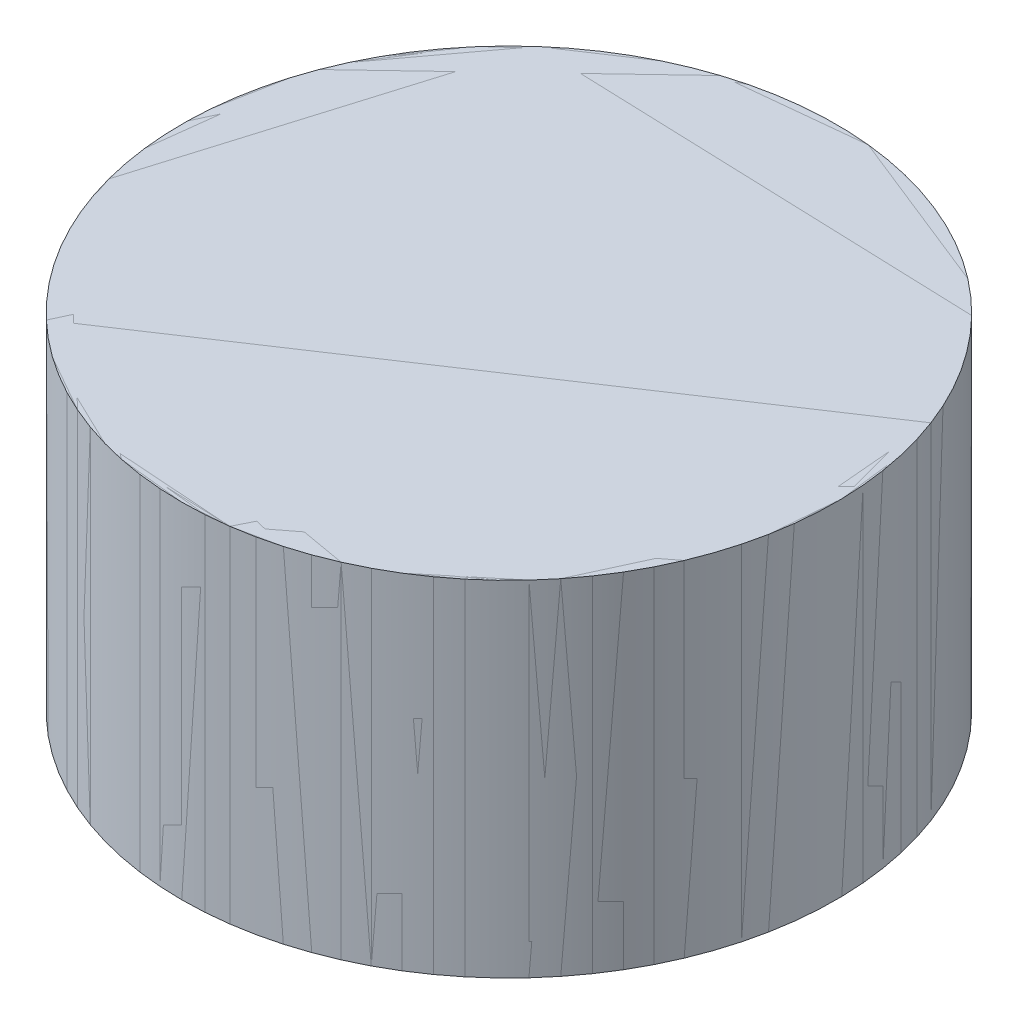
ISO-10303-21;
HEADER;
FILE_DESCRIPTION(('STEP AP214'),'2;1');
FILE_NAME('part.step','',(''),(''),'','','');
FILE_SCHEMA(('AUTOMOTIVE_DESIGN { 1 0 10303 214 1 1 1 1 }'));
ENDSEC;
DATA;
#1=APPLICATION_CONTEXT('core data for automotive mechanical design processes');
#2=APPLICATION_PROTOCOL_DEFINITION('international standard','automotive_design',2000,#1);
#3=PRODUCT_CONTEXT('',#1,'mechanical');
#4=PRODUCT('Part','Part','',(#3));
#5=PRODUCT_RELATED_PRODUCT_CATEGORY('part','',(#4));
#6=PRODUCT_DEFINITION_FORMATION('','',#4);
#7=PRODUCT_DEFINITION_CONTEXT('part definition',#1,'design');
#8=PRODUCT_DEFINITION('design','',#6,#7);
#9=PRODUCT_DEFINITION_SHAPE('','',#8);
#10=(LENGTH_UNIT() NAMED_UNIT(*) SI_UNIT(.MILLI.,.METRE.));
#11=(NAMED_UNIT(*) PLANE_ANGLE_UNIT() SI_UNIT($,.RADIAN.));
#12=(NAMED_UNIT(*) SI_UNIT($,.STERADIAN.) SOLID_ANGLE_UNIT());
#13=UNCERTAINTY_MEASURE_WITH_UNIT(LENGTH_MEASURE(1.E-05),#10,'distance_accuracy_value','');
#14=(GEOMETRIC_REPRESENTATION_CONTEXT(3) GLOBAL_UNCERTAINTY_ASSIGNED_CONTEXT((#13)) GLOBAL_UNIT_ASSIGNED_CONTEXT((#10,
#11,#12)) REPRESENTATION_CONTEXT('',''));
#15=CARTESIAN_POINT('',(0.,0.,0.));
#16=DIRECTION('',(0.,0.,1.));
#17=DIRECTION('',(1.,0.,0.));
#18=AXIS2_PLACEMENT_3D('',#15,#16,#17);
#19=CARTESIAN_POINT('',(0.,127.,0.));
#20=DIRECTION('',(0.,-1.,0.));
#21=DIRECTION('',(0.,0.,-1.));
#22=AXIS2_PLACEMENT_3D('',#19,#20,#21);
#23=CYLINDRICAL_SURFACE('',#22,120.65);
#24=CARTESIAN_POINT('',(0.,127.,0.));
#25=DIRECTION('',(0.,1.,0.));
#26=DIRECTION('',(0.,0.,1.));
#27=AXIS2_PLACEMENT_3D('',#24,#25,#26);
#28=CIRCLE('',#27,120.65);
#29=CARTESIAN_POINT('',(0.,127.,120.65));
#30=VERTEX_POINT('',#29);
#31=EDGE_CURVE('E13',#30,#30,#28,.T.);
#32=ORIENTED_EDGE('',*,*,#31,.F.);
#33=EDGE_LOOP('',(#32));
#34=FACE_BOUND('',#33,.T.);
#35=CARTESIAN_POINT('',(0.,0.,0.));
#36=DIRECTION('',(0.,1.,0.));
#37=DIRECTION('',(0.,0.,1.));
#38=AXIS2_PLACEMENT_3D('',#35,#36,#37);
#39=CIRCLE('',#38,120.65);
#40=CARTESIAN_POINT('',(0.,0.,120.65));
#41=VERTEX_POINT('',#40);
#42=EDGE_CURVE('E69',#41,#41,#39,.T.);
#43=ORIENTED_EDGE('',*,*,#42,.T.);
#44=EDGE_LOOP('',(#43));
#45=FACE_BOUND('',#44,.T.);
#46=ADVANCED_FACE('F66',(#34,#45),#23,.T.);
#47=CARTESIAN_POINT('',(0.,127.,0.));
#48=DIRECTION('',(0.,1.,0.));
#49=DIRECTION('',(0.,0.,1.));
#50=AXIS2_PLACEMENT_3D('',#47,#48,#49);
#51=PLANE('',#50);
#52=ORIENTED_EDGE('',*,*,#31,.T.);
#53=EDGE_LOOP('',(#52));
#54=FACE_BOUND('',#53,.T.);
#55=ADVANCED_FACE('F83',(#54),#51,.T.);
#56=CARTESIAN_POINT('',(0.,0.,0.));
#57=DIRECTION('',(0.,1.,0.));
#58=DIRECTION('',(0.,0.,1.));
#59=AXIS2_PLACEMENT_3D('',#56,#57,#58);
#60=PLANE('',#59);
#61=ORIENTED_EDGE('',*,*,#42,.F.);
#62=EDGE_LOOP('',(#61));
#63=FACE_BOUND('',#62,.T.);
#64=ADVANCED_FACE('F81',(#63),#60,.F.);
#65=CLOSED_SHELL('',(#46,#55,#64));
#66=MANIFOLD_SOLID_BREP('B2',#65);
#67=CARTESIAN_POINT('',(0.,0.,0.));
#68=DIRECTION('',(0.,1.,0.));
#69=DIRECTION('',(0.,0.,1.));
#70=AXIS2_PLACEMENT_3D('',#67,#68,#69);
#71=PLANE('',#70);
#72=CARTESIAN_POINT('',(0.,0.,0.));
#73=DIRECTION('',(0.,1.,0.));
#74=DIRECTION('',(0.,0.,1.));
#75=AXIS2_PLACEMENT_3D('',#72,#73,#74);
#76=CIRCLE('',#75,120.65);
#77=CARTESIAN_POINT('',(0.,0.,120.65));
#78=VERTEX_POINT('',#77);
#79=EDGE_CURVE('E121',#78,#78,#76,.T.);
#80=ORIENTED_EDGE('',*,*,#79,.F.);
#81=EDGE_LOOP('',(#80));
#82=FACE_BOUND('',#81,.T.);
#83=ADVANCED_FACE('F114',(#82),#71,.F.);
#84=CARTESIAN_POINT('',(0.,127.,0.));
#85=DIRECTION('',(0.,-1.,0.));
#86=DIRECTION('',(0.,0.,-1.));
#87=AXIS2_PLACEMENT_3D('',#84,#85,#86);
#88=PLANE('',#87);
#89=CARTESIAN_POINT('',(0.,127.,0.));
#90=DIRECTION('',(0.,1.,0.));
#91=DIRECTION('',(0.,0.,1.));
#92=AXIS2_PLACEMENT_3D('',#89,#90,#91);
#93=CIRCLE('',#92,120.65);
#94=CARTESIAN_POINT('',(0.,127.,120.65));
#95=VERTEX_POINT('',#94);
#96=EDGE_CURVE('E65',#95,#95,#93,.T.);
#97=ORIENTED_EDGE('',*,*,#96,.T.);
#98=EDGE_LOOP('',(#97));
#99=FACE_BOUND('',#98,.T.);
#100=ADVANCED_FACE('F138',(#99),#88,.F.);
#101=CARTESIAN_POINT('',(0.,0.,0.));
#102=DIRECTION('',(0.,1.,0.));
#103=DIRECTION('',(0.,0.,1.));
#104=AXIS2_PLACEMENT_3D('',#101,#102,#103);
#105=CYLINDRICAL_SURFACE('',#104,120.65);
#106=ORIENTED_EDGE('',*,*,#79,.T.);
#107=EDGE_LOOP('',(#106));
#108=FACE_BOUND('',#107,.T.);
#109=ORIENTED_EDGE('',*,*,#96,.F.);
#110=EDGE_LOOP('',(#109));
#111=FACE_BOUND('',#110,.T.);
#112=ADVANCED_FACE('F134',(#108,#111),#105,.T.);
#113=OPEN_SHELL('',(#83,#100,#112));
#114=SHELL_BASED_SURFACE_MODEL('B8',(#113));
#115=ADVANCED_BREP_SHAPE_REPRESENTATION('',(#18,#66),#14);
#116=MANIFOLD_SURFACE_SHAPE_REPRESENTATION('',(#18,#114),#14);
#117=SHAPE_REPRESENTATION('',(#18),#14);
#118=SHAPE_DEFINITION_REPRESENTATION(#9,#117);
#119=SHAPE_REPRESENTATION_RELATIONSHIP('','',#117,#115);
#120=SHAPE_REPRESENTATION_RELATIONSHIP('','',#117,#116);
ENDSEC;
END-ISO-10303-21;
